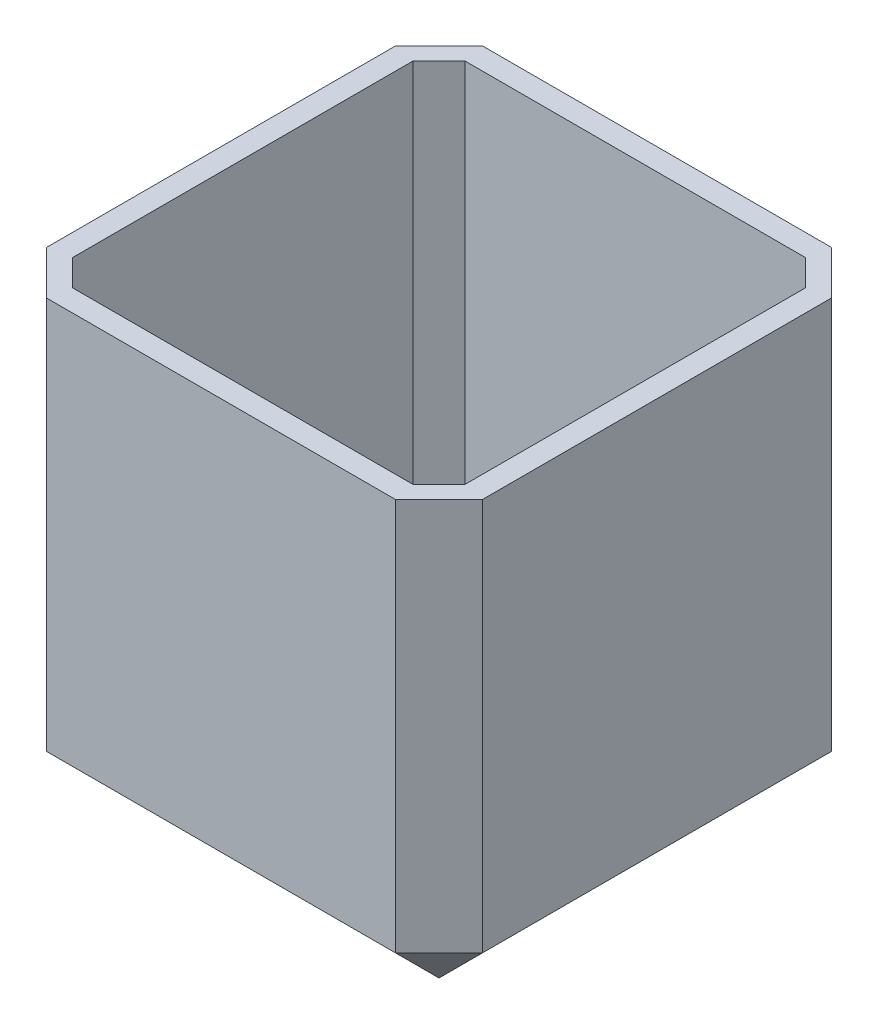
ISO-10303-21;
HEADER;
FILE_DESCRIPTION(('STEP AP214'),'2;1');
FILE_NAME('part.step','',(''),(''),'','','');
FILE_SCHEMA(('AUTOMOTIVE_DESIGN { 1 0 10303 214 1 1 1 1 }'));
ENDSEC;
DATA;
#1=APPLICATION_CONTEXT('core data for automotive mechanical design processes');
#2=APPLICATION_PROTOCOL_DEFINITION('international standard','automotive_design',2000,#1);
#3=PRODUCT_CONTEXT('',#1,'mechanical');
#4=PRODUCT('Part','Part','',(#3));
#5=PRODUCT_RELATED_PRODUCT_CATEGORY('part','',(#4));
#6=PRODUCT_DEFINITION_FORMATION('','',#4);
#7=PRODUCT_DEFINITION_CONTEXT('part definition',#1,'design');
#8=PRODUCT_DEFINITION('design','',#6,#7);
#9=PRODUCT_DEFINITION_SHAPE('','',#8);
#10=(LENGTH_UNIT() NAMED_UNIT(*) SI_UNIT(.MILLI.,.METRE.));
#11=(NAMED_UNIT(*) PLANE_ANGLE_UNIT() SI_UNIT($,.RADIAN.));
#12=(NAMED_UNIT(*) SI_UNIT($,.STERADIAN.) SOLID_ANGLE_UNIT());
#13=UNCERTAINTY_MEASURE_WITH_UNIT(LENGTH_MEASURE(1.E-05),#10,'distance_accuracy_value','');
#14=(GEOMETRIC_REPRESENTATION_CONTEXT(3) GLOBAL_UNCERTAINTY_ASSIGNED_CONTEXT((#13)) GLOBAL_UNIT_ASSIGNED_CONTEXT((#10,
#11,#12)) REPRESENTATION_CONTEXT('',''));
#15=CARTESIAN_POINT('',(0.,0.,0.));
#16=DIRECTION('',(0.,0.,1.));
#17=DIRECTION('',(1.,0.,0.));
#18=AXIS2_PLACEMENT_3D('',#15,#16,#17);
#19=CARTESIAN_POINT('',(0.,50.,0.));
#20=DIRECTION('',(0.,-1.,0.));
#21=DIRECTION('',(0.,0.,-1.));
#22=AXIS2_PLACEMENT_3D('',#19,#20,#21);
#23=PLANE('',#22);
#24=DIRECTION('',(0.707106781186548,0.,0.707106781186548));
#25=VECTOR('',#24,1.);
#26=CARTESIAN_POINT('',(20.,50.,-25.));
#27=LINE('',#26,#25);
#28=CARTESIAN_POINT('',(25.,50.,-20.));
#29=VERTEX_POINT('',#28);
#30=CARTESIAN_POINT('',(22.5,50.,-22.5));
#31=VERTEX_POINT('',#30);
#32=EDGE_CURVE('E222',#29,#31,#27,.F.);
#33=ORIENTED_EDGE('',*,*,#32,.T.);
#34=DIRECTION('',(0.707106781186548,0.,0.707106781186548));
#35=VECTOR('',#34,1.);
#36=CARTESIAN_POINT('',(20.,50.,-25.));
#37=LINE('',#36,#35);
#38=CARTESIAN_POINT('',(20.,50.,-25.));
#39=VERTEX_POINT('',#38);
#40=EDGE_CURVE('E206',#31,#39,#37,.F.);
#41=ORIENTED_EDGE('',*,*,#40,.T.);
#42=DIRECTION('',(-1.,0.,0.));
#43=VECTOR('',#42,1.);
#44=CARTESIAN_POINT('',(-25.,50.,-25.));
#45=LINE('',#44,#43);
#46=CARTESIAN_POINT('',(-20.,50.,-25.));
#47=VERTEX_POINT('',#46);
#48=EDGE_CURVE('E384',#39,#47,#45,.T.);
#49=ORIENTED_EDGE('',*,*,#48,.T.);
#50=DIRECTION('',(0.707106781186547,0.,-0.707106781186548));
#51=VECTOR('',#50,1.);
#52=CARTESIAN_POINT('',(-25.,50.,-20.));
#53=LINE('',#52,#51);
#54=CARTESIAN_POINT('',(-22.5,50.,-22.5));
#55=VERTEX_POINT('',#54);
#56=EDGE_CURVE('E228',#47,#55,#53,.F.);
#57=ORIENTED_EDGE('',*,*,#56,.T.);
#58=DIRECTION('',(0.707106781186547,0.,-0.707106781186548));
#59=VECTOR('',#58,1.);
#60=CARTESIAN_POINT('',(-25.,50.,-20.));
#61=LINE('',#60,#59);
#62=CARTESIAN_POINT('',(-25.,50.,-20.));
#63=VERTEX_POINT('',#62);
#64=EDGE_CURVE('E225',#55,#63,#61,.F.);
#65=ORIENTED_EDGE('',*,*,#64,.T.);
#66=DIRECTION('',(0.,0.,1.));
#67=VECTOR('',#66,1.);
#68=CARTESIAN_POINT('',(-25.,50.,25.));
#69=LINE('',#68,#67);
#70=CARTESIAN_POINT('',(-25.,50.,20.));
#71=VERTEX_POINT('',#70);
#72=EDGE_CURVE('E202',#63,#71,#69,.T.);
#73=ORIENTED_EDGE('',*,*,#72,.T.);
#74=DIRECTION('',(-0.707106781186548,0.,-0.707106781186548));
#75=VECTOR('',#74,1.);
#76=CARTESIAN_POINT('',(-20.,50.,25.));
#77=LINE('',#76,#75);
#78=CARTESIAN_POINT('',(-22.5,50.,22.5));
#79=VERTEX_POINT('',#78);
#80=EDGE_CURVE('E195',#71,#79,#77,.F.);
#81=ORIENTED_EDGE('',*,*,#80,.T.);
#82=DIRECTION('',(-0.707106781186548,0.,-0.707106781186548));
#83=VECTOR('',#82,1.);
#84=CARTESIAN_POINT('',(-20.,50.,25.));
#85=LINE('',#84,#83);
#86=CARTESIAN_POINT('',(-20.,50.,25.));
#87=VERTEX_POINT('',#86);
#88=EDGE_CURVE('E199',#79,#87,#85,.F.);
#89=ORIENTED_EDGE('',*,*,#88,.T.);
#90=DIRECTION('',(1.,0.,0.));
#91=VECTOR('',#90,1.);
#92=CARTESIAN_POINT('',(-25.,50.,25.));
#93=LINE('',#92,#91);
#94=CARTESIAN_POINT('',(20.,50.,25.));
#95=VERTEX_POINT('',#94);
#96=EDGE_CURVE('E390',#87,#95,#93,.T.);
#97=ORIENTED_EDGE('',*,*,#96,.T.);
#98=DIRECTION('',(-0.707106781186548,0.,0.707106781186547));
#99=VECTOR('',#98,1.);
#100=CARTESIAN_POINT('',(25.,50.,20.));
#101=LINE('',#100,#99);
#102=CARTESIAN_POINT('',(22.5,50.,22.5));
#103=VERTEX_POINT('',#102);
#104=EDGE_CURVE('E213',#95,#103,#101,.F.);
#105=ORIENTED_EDGE('',*,*,#104,.T.);
#106=DIRECTION('',(-0.707106781186548,0.,0.707106781186547));
#107=VECTOR('',#106,1.);
#108=CARTESIAN_POINT('',(25.,50.,20.));
#109=LINE('',#108,#107);
#110=CARTESIAN_POINT('',(25.,50.,20.));
#111=VERTEX_POINT('',#110);
#112=EDGE_CURVE('E216',#103,#111,#109,.F.);
#113=ORIENTED_EDGE('',*,*,#112,.T.);
#114=DIRECTION('',(0.,0.,-1.));
#115=VECTOR('',#114,1.);
#116=CARTESIAN_POINT('',(25.,50.,25.));
#117=LINE('',#116,#115);
#118=EDGE_CURVE('E375',#111,#29,#117,.T.);
#119=ORIENTED_EDGE('',*,*,#118,.T.);
#120=EDGE_LOOP('',(#33,#41,#49,#57,#65,#73,#81,#89,#97,#105,#113,#119));
#121=FACE_BOUND('',#120,.T.);
#122=DIRECTION('',(-0.707106781186548,0.,-0.707106781186548));
#123=VECTOR('',#122,1.);
#124=CARTESIAN_POINT('',(21.,50.,-21.));
#125=LINE('',#124,#123);
#126=CARTESIAN_POINT('',(19.5,50.,-22.5));
#127=VERTEX_POINT('',#126);
#128=CARTESIAN_POINT('',(22.5,50.,-19.5));
#129=VERTEX_POINT('',#128);
#130=EDGE_CURVE('E14',#127,#129,#125,.F.);
#131=ORIENTED_EDGE('',*,*,#130,.T.);
#132=DIRECTION('',(0.,0.,-1.));
#133=VECTOR('',#132,1.);
#134=CARTESIAN_POINT('',(22.5,50.,22.5));
#135=LINE('',#134,#133);
#136=CARTESIAN_POINT('',(22.5,50.,19.5));
#137=VERTEX_POINT('',#136);
#138=EDGE_CURVE('E72',#137,#129,#135,.T.);
#139=ORIENTED_EDGE('',*,*,#138,.F.);
#140=DIRECTION('',(0.707106781186549,0.,-0.707106781186546));
#141=VECTOR('',#140,1.);
#142=CARTESIAN_POINT('',(21.,50.,21.));
#143=LINE('',#142,#141);
#144=CARTESIAN_POINT('',(19.5,50.,22.5));
#145=VERTEX_POINT('',#144);
#146=EDGE_CURVE('E65',#137,#145,#143,.F.);
#147=ORIENTED_EDGE('',*,*,#146,.T.);
#148=DIRECTION('',(1.,0.,0.));
#149=VECTOR('',#148,1.);
#150=CARTESIAN_POINT('',(-22.5,50.,22.5));
#151=LINE('',#150,#149);
#152=CARTESIAN_POINT('',(-19.5,50.,22.5));
#153=VERTEX_POINT('',#152);
#154=EDGE_CURVE('E79',#153,#145,#151,.T.);
#155=ORIENTED_EDGE('',*,*,#154,.F.);
#156=DIRECTION('',(0.707106781186548,0.,0.707106781186548));
#157=VECTOR('',#156,1.);
#158=CARTESIAN_POINT('',(-21.,50.,21.));
#159=LINE('',#158,#157);
#160=CARTESIAN_POINT('',(-22.5,50.,19.5));
#161=VERTEX_POINT('',#160);
#162=EDGE_CURVE('E345',#153,#161,#159,.F.);
#163=ORIENTED_EDGE('',*,*,#162,.T.);
#164=DIRECTION('',(0.,0.,1.));
#165=VECTOR('',#164,1.);
#166=CARTESIAN_POINT('',(-22.5,50.,22.5));
#167=LINE('',#166,#165);
#168=CARTESIAN_POINT('',(-22.5,50.,-19.5));
#169=VERTEX_POINT('',#168);
#170=EDGE_CURVE('E519',#169,#161,#167,.T.);
#171=ORIENTED_EDGE('',*,*,#170,.F.);
#172=DIRECTION('',(-0.707106781186546,0.,0.707106781186549));
#173=VECTOR('',#172,1.);
#174=CARTESIAN_POINT('',(-21.,50.,-21.));
#175=LINE('',#174,#173);
#176=CARTESIAN_POINT('',(-19.5,50.,-22.5));
#177=VERTEX_POINT('',#176);
#178=EDGE_CURVE('E349',#169,#177,#175,.F.);
#179=ORIENTED_EDGE('',*,*,#178,.T.);
#180=DIRECTION('',(-1.,0.,0.));
#181=VECTOR('',#180,1.);
#182=CARTESIAN_POINT('',(-22.5,50.,-22.5));
#183=LINE('',#182,#181);
#184=EDGE_CURVE('E515',#127,#177,#183,.T.);
#185=ORIENTED_EDGE('',*,*,#184,.F.);
#186=EDGE_LOOP('',(#131,#139,#147,#155,#163,#171,#179,#185));
#187=FACE_BOUND('',#186,.T.);
#188=ADVANCED_FACE('F55',(#121,#187),#23,.F.);
#189=CARTESIAN_POINT('',(25.,50.,25.));
#190=DIRECTION('',(-1.,0.,0.));
#191=DIRECTION('',(0.,0.,1.));
#192=AXIS2_PLACEMENT_3D('',#189,#190,#191);
#193=PLANE('',#192);
#194=DIRECTION('',(0.,0.,-1.));
#195=VECTOR('',#194,1.);
#196=CARTESIAN_POINT('',(25.,5.,-25.));
#197=LINE('',#196,#195);
#198=CARTESIAN_POINT('',(25.,5.,20.));
#199=VERTEX_POINT('',#198);
#200=CARTESIAN_POINT('',(25.,5.,-20.));
#201=VERTEX_POINT('',#200);
#202=EDGE_CURVE('E247',#199,#201,#197,.T.);
#203=ORIENTED_EDGE('',*,*,#202,.T.);
#204=DIRECTION('',(0.,1.,0.));
#205=VECTOR('',#204,1.);
#206=CARTESIAN_POINT('',(25.,50.,-20.));
#207=LINE('',#206,#205);
#208=EDGE_CURVE('E250',#201,#29,#207,.T.);
#209=ORIENTED_EDGE('',*,*,#208,.T.);
#210=ORIENTED_EDGE('',*,*,#118,.F.);
#211=DIRECTION('',(0.,-1.,0.));
#212=VECTOR('',#211,1.);
#213=CARTESIAN_POINT('',(25.,50.,20.));
#214=LINE('',#213,#212);
#215=EDGE_CURVE('E244',#111,#199,#214,.T.);
#216=ORIENTED_EDGE('',*,*,#215,.T.);
#217=EDGE_LOOP('',(#203,#209,#210,#216));
#218=FACE_BOUND('',#217,.T.);
#219=ADVANCED_FACE('F419',(#218),#193,.F.);
#220=CARTESIAN_POINT('',(-25.,50.,-25.));
#221=DIRECTION('',(0.,0.,1.));
#222=DIRECTION('',(1.,0.,0.));
#223=AXIS2_PLACEMENT_3D('',#220,#221,#222);
#224=PLANE('',#223);
#225=DIRECTION('',(-1.,0.,0.));
#226=VECTOR('',#225,1.);
#227=CARTESIAN_POINT('',(-25.,5.,-25.));
#228=LINE('',#227,#226);
#229=CARTESIAN_POINT('',(20.,5.,-25.));
#230=VERTEX_POINT('',#229);
#231=CARTESIAN_POINT('',(-20.,5.,-25.));
#232=VERTEX_POINT('',#231);
#233=EDGE_CURVE('E406',#230,#232,#228,.T.);
#234=ORIENTED_EDGE('',*,*,#233,.T.);
#235=DIRECTION('',(0.,1.,0.));
#236=VECTOR('',#235,1.);
#237=CARTESIAN_POINT('',(-20.,50.,-25.));
#238=LINE('',#237,#236);
#239=EDGE_CURVE('E409',#232,#47,#238,.T.);
#240=ORIENTED_EDGE('',*,*,#239,.T.);
#241=ORIENTED_EDGE('',*,*,#48,.F.);
#242=DIRECTION('',(0.,-1.,0.));
#243=VECTOR('',#242,1.);
#244=CARTESIAN_POINT('',(20.,50.,-25.));
#245=LINE('',#244,#243);
#246=EDGE_CURVE('E403',#39,#230,#245,.T.);
#247=ORIENTED_EDGE('',*,*,#246,.T.);
#248=EDGE_LOOP('',(#234,#240,#241,#247));
#249=FACE_BOUND('',#248,.T.);
#250=ADVANCED_FACE('F443',(#249),#224,.F.);
#251=CARTESIAN_POINT('',(-25.,50.,25.));
#252=DIRECTION('',(1.,0.,0.));
#253=DIRECTION('',(0.,0.,-1.));
#254=AXIS2_PLACEMENT_3D('',#251,#252,#253);
#255=PLANE('',#254);
#256=ORIENTED_EDGE('',*,*,#72,.F.);
#257=DIRECTION('',(0.,-1.,0.));
#258=VECTOR('',#257,1.);
#259=CARTESIAN_POINT('',(-25.,50.,-20.));
#260=LINE('',#259,#258);
#261=CARTESIAN_POINT('',(-25.,5.,-20.));
#262=VERTEX_POINT('',#261);
#263=EDGE_CURVE('E399',#63,#262,#260,.T.);
#264=ORIENTED_EDGE('',*,*,#263,.T.);
#265=DIRECTION('',(0.,0.,1.));
#266=VECTOR('',#265,1.);
#267=CARTESIAN_POINT('',(-25.,5.,25.));
#268=LINE('',#267,#266);
#269=CARTESIAN_POINT('',(-25.,5.,20.));
#270=VERTEX_POINT('',#269);
#271=EDGE_CURVE('E396',#262,#270,#268,.T.);
#272=ORIENTED_EDGE('',*,*,#271,.T.);
#273=DIRECTION('',(0.,1.,0.));
#274=VECTOR('',#273,1.);
#275=CARTESIAN_POINT('',(-25.,50.,20.));
#276=LINE('',#275,#274);
#277=EDGE_CURVE('E393',#270,#71,#276,.T.);
#278=ORIENTED_EDGE('',*,*,#277,.T.);
#279=EDGE_LOOP('',(#256,#264,#272,#278));
#280=FACE_BOUND('',#279,.T.);
#281=ADVANCED_FACE('F462',(#280),#255,.F.);
#282=CARTESIAN_POINT('',(-25.,50.,25.));
#283=DIRECTION('',(0.,0.,-1.));
#284=DIRECTION('',(-1.,0.,0.));
#285=AXIS2_PLACEMENT_3D('',#282,#283,#284);
#286=PLANE('',#285);
#287=ORIENTED_EDGE('',*,*,#96,.F.);
#288=DIRECTION('',(0.,-1.,0.));
#289=VECTOR('',#288,1.);
#290=CARTESIAN_POINT('',(-20.,50.,25.));
#291=LINE('',#290,#289);
#292=CARTESIAN_POINT('',(-20.,5.,25.));
#293=VERTEX_POINT('',#292);
#294=EDGE_CURVE('E211',#87,#293,#291,.T.);
#295=ORIENTED_EDGE('',*,*,#294,.T.);
#296=DIRECTION('',(1.,0.,0.));
#297=VECTOR('',#296,1.);
#298=CARTESIAN_POINT('',(25.,5.,25.));
#299=LINE('',#298,#297);
#300=CARTESIAN_POINT('',(20.,5.,25.));
#301=VERTEX_POINT('',#300);
#302=EDGE_CURVE('E256',#293,#301,#299,.T.);
#303=ORIENTED_EDGE('',*,*,#302,.T.);
#304=DIRECTION('',(0.,1.,0.));
#305=VECTOR('',#304,1.);
#306=CARTESIAN_POINT('',(20.,50.,25.));
#307=LINE('',#306,#305);
#308=EDGE_CURVE('E253',#301,#95,#307,.T.);
#309=ORIENTED_EDGE('',*,*,#308,.T.);
#310=EDGE_LOOP('',(#287,#295,#303,#309));
#311=FACE_BOUND('',#310,.T.);
#312=ADVANCED_FACE('F470',(#311),#286,.F.);
#313=CARTESIAN_POINT('',(0.,0.,0.));
#314=DIRECTION('',(0.,-1.,0.));
#315=DIRECTION('',(0.,0.,-1.));
#316=AXIS2_PLACEMENT_3D('',#313,#314,#315);
#317=PLANE('',#316);
#318=DIRECTION('',(-1.,0.,0.));
#319=VECTOR('',#318,1.);
#320=CARTESIAN_POINT('',(-25.,0.,20.));
#321=LINE('',#320,#319);
#322=CARTESIAN_POINT('',(20.,0.,20.));
#323=VERTEX_POINT('',#322);
#324=CARTESIAN_POINT('',(-20.,0.,20.));
#325=VERTEX_POINT('',#324);
#326=EDGE_CURVE('E231',#323,#325,#321,.T.);
#327=ORIENTED_EDGE('',*,*,#326,.T.);
#328=DIRECTION('',(0.,0.,-1.));
#329=VECTOR('',#328,1.);
#330=CARTESIAN_POINT('',(-20.,0.,-25.));
#331=LINE('',#330,#329);
#332=CARTESIAN_POINT('',(-20.,0.,-20.));
#333=VERTEX_POINT('',#332);
#334=EDGE_CURVE('E240',#325,#333,#331,.T.);
#335=ORIENTED_EDGE('',*,*,#334,.T.);
#336=DIRECTION('',(1.,0.,0.));
#337=VECTOR('',#336,1.);
#338=CARTESIAN_POINT('',(25.,0.,-20.));
#339=LINE('',#338,#337);
#340=CARTESIAN_POINT('',(20.,0.,-20.));
#341=VERTEX_POINT('',#340);
#342=EDGE_CURVE('E237',#333,#341,#339,.T.);
#343=ORIENTED_EDGE('',*,*,#342,.T.);
#344=DIRECTION('',(0.,0.,1.));
#345=VECTOR('',#344,1.);
#346=CARTESIAN_POINT('',(20.,0.,25.));
#347=LINE('',#346,#345);
#348=EDGE_CURVE('E234',#341,#323,#347,.T.);
#349=ORIENTED_EDGE('',*,*,#348,.T.);
#350=EDGE_LOOP('',(#327,#335,#343,#349));
#351=FACE_BOUND('',#350,.T.);
#352=ADVANCED_FACE('F472',(#351),#317,.T.);
#353=CARTESIAN_POINT('',(0.,5.,0.));
#354=DIRECTION('',(0.,-1.,0.));
#355=DIRECTION('',(0.,0.,-1.));
#356=AXIS2_PLACEMENT_3D('',#353,#354,#355);
#357=PLANE('',#356);
#358=DIRECTION('',(0.,0.,1.));
#359=VECTOR('',#358,1.);
#360=CARTESIAN_POINT('',(-22.5,5.,22.5));
#361=LINE('',#360,#359);
#362=CARTESIAN_POINT('',(-22.5,5.,-19.5));
#363=VERTEX_POINT('',#362);
#364=CARTESIAN_POINT('',(-22.5,5.,19.5));
#365=VERTEX_POINT('',#364);
#366=EDGE_CURVE('E371',#363,#365,#361,.T.);
#367=ORIENTED_EDGE('',*,*,#366,.T.);
#368=DIRECTION('',(-0.707106781186548,0.,-0.707106781186548));
#369=VECTOR('',#368,1.);
#370=CARTESIAN_POINT('',(-19.5,5.,22.5));
#371=LINE('',#370,#369);
#372=CARTESIAN_POINT('',(-19.5,5.,22.5));
#373=VERTEX_POINT('',#372);
#374=EDGE_CURVE('E329',#365,#373,#371,.F.);
#375=ORIENTED_EDGE('',*,*,#374,.T.);
#376=DIRECTION('',(1.,0.,0.));
#377=VECTOR('',#376,1.);
#378=CARTESIAN_POINT('',(-22.5,5.,22.5));
#379=LINE('',#378,#377);
#380=CARTESIAN_POINT('',(19.5,5.,22.5));
#381=VERTEX_POINT('',#380);
#382=EDGE_CURVE('E361',#373,#381,#379,.T.);
#383=ORIENTED_EDGE('',*,*,#382,.T.);
#384=DIRECTION('',(-0.707106781186549,0.,0.707106781186546));
#385=VECTOR('',#384,1.);
#386=CARTESIAN_POINT('',(22.5,5.,19.5));
#387=LINE('',#386,#385);
#388=CARTESIAN_POINT('',(22.5,5.,19.5));
#389=VERTEX_POINT('',#388);
#390=EDGE_CURVE('E323',#381,#389,#387,.F.);
#391=ORIENTED_EDGE('',*,*,#390,.T.);
#392=DIRECTION('',(0.,0.,-1.));
#393=VECTOR('',#392,1.);
#394=CARTESIAN_POINT('',(22.5,5.,22.5));
#395=LINE('',#394,#393);
#396=CARTESIAN_POINT('',(22.5,5.,-19.5));
#397=VERTEX_POINT('',#396);
#398=EDGE_CURVE('E370',#389,#397,#395,.T.);
#399=ORIENTED_EDGE('',*,*,#398,.T.);
#400=DIRECTION('',(0.707106781186548,0.,0.707106781186548));
#401=VECTOR('',#400,1.);
#402=CARTESIAN_POINT('',(19.5,5.,-22.5));
#403=LINE('',#402,#401);
#404=CARTESIAN_POINT('',(19.5,5.,-22.5));
#405=VERTEX_POINT('',#404);
#406=EDGE_CURVE('E320',#397,#405,#403,.F.);
#407=ORIENTED_EDGE('',*,*,#406,.T.);
#408=DIRECTION('',(-1.,0.,0.));
#409=VECTOR('',#408,1.);
#410=CARTESIAN_POINT('',(-22.5,5.,-22.5));
#411=LINE('',#410,#409);
#412=CARTESIAN_POINT('',(-19.5,5.,-22.5));
#413=VERTEX_POINT('',#412);
#414=EDGE_CURVE('E377',#405,#413,#411,.T.);
#415=ORIENTED_EDGE('',*,*,#414,.T.);
#416=DIRECTION('',(0.707106781186546,0.,-0.707106781186549));
#417=VECTOR('',#416,1.);
#418=CARTESIAN_POINT('',(-22.5,5.,-19.5));
#419=LINE('',#418,#417);
#420=EDGE_CURVE('E326',#413,#363,#419,.F.);
#421=ORIENTED_EDGE('',*,*,#420,.T.);
#422=EDGE_LOOP('',(#367,#375,#383,#391,#399,#407,#415,#421));
#423=FACE_BOUND('',#422,.T.);
#424=ADVANCED_FACE('F365',(#423),#357,.F.);
#425=CARTESIAN_POINT('',(-22.5,-63.6396103067893,-22.5));
#426=DIRECTION('',(0.,0.,-1.));
#427=DIRECTION('',(-1.,0.,0.));
#428=AXIS2_PLACEMENT_3D('',#425,#426,#427);
#429=PLANE('',#428);
#430=ORIENTED_EDGE('',*,*,#184,.T.);
#431=DIRECTION('',(0.,-1.,0.));
#432=VECTOR('',#431,1.);
#433=CARTESIAN_POINT('',(-19.5,5.,-22.5));
#434=LINE('',#433,#432);
#435=EDGE_CURVE('E336',#177,#413,#434,.T.);
#436=ORIENTED_EDGE('',*,*,#435,.T.);
#437=ORIENTED_EDGE('',*,*,#414,.F.);
#438=DIRECTION('',(0.,1.,0.));
#439=VECTOR('',#438,1.);
#440=CARTESIAN_POINT('',(19.5,50.,-22.5));
#441=LINE('',#440,#439);
#442=EDGE_CURVE('E332',#405,#127,#441,.T.);
#443=ORIENTED_EDGE('',*,*,#442,.T.);
#444=EDGE_LOOP('',(#430,#436,#437,#443));
#445=FACE_BOUND('',#444,.T.);
#446=ADVANCED_FACE('F491',(#445),#429,.F.);
#447=CARTESIAN_POINT('',(-22.5,-63.6396103067893,22.5));
#448=DIRECTION('',(-1.,0.,0.));
#449=DIRECTION('',(0.,0.,1.));
#450=AXIS2_PLACEMENT_3D('',#447,#448,#449);
#451=PLANE('',#450);
#452=ORIENTED_EDGE('',*,*,#170,.T.);
#453=DIRECTION('',(0.,-1.,0.));
#454=VECTOR('',#453,1.);
#455=CARTESIAN_POINT('',(-22.5,5.,19.5));
#456=LINE('',#455,#454);
#457=EDGE_CURVE('E317',#161,#365,#456,.T.);
#458=ORIENTED_EDGE('',*,*,#457,.T.);
#459=ORIENTED_EDGE('',*,*,#366,.F.);
#460=DIRECTION('',(0.,1.,0.));
#461=VECTOR('',#460,1.);
#462=CARTESIAN_POINT('',(-22.5,50.,-19.5));
#463=LINE('',#462,#461);
#464=EDGE_CURVE('E313',#363,#169,#463,.T.);
#465=ORIENTED_EDGE('',*,*,#464,.T.);
#466=EDGE_LOOP('',(#452,#458,#459,#465));
#467=FACE_BOUND('',#466,.T.);
#468=ADVANCED_FACE('F494',(#467),#451,.F.);
#469=CARTESIAN_POINT('',(-22.5,-63.6396103067893,22.5));
#470=DIRECTION('',(0.,0.,1.));
#471=DIRECTION('',(1.,0.,0.));
#472=AXIS2_PLACEMENT_3D('',#469,#470,#471);
#473=PLANE('',#472);
#474=ORIENTED_EDGE('',*,*,#382,.F.);
#475=DIRECTION('',(0.,1.,0.));
#476=VECTOR('',#475,1.);
#477=CARTESIAN_POINT('',(-19.5,50.,22.5));
#478=LINE('',#477,#476);
#479=EDGE_CURVE('E310',#373,#153,#478,.T.);
#480=ORIENTED_EDGE('',*,*,#479,.T.);
#481=ORIENTED_EDGE('',*,*,#154,.T.);
#482=DIRECTION('',(0.,-1.,0.));
#483=VECTOR('',#482,1.);
#484=CARTESIAN_POINT('',(19.5,5.,22.5));
#485=LINE('',#484,#483);
#486=EDGE_CURVE('E261',#145,#381,#485,.T.);
#487=ORIENTED_EDGE('',*,*,#486,.T.);
#488=EDGE_LOOP('',(#474,#480,#481,#487));
#489=FACE_BOUND('',#488,.T.);
#490=ADVANCED_FACE('F360',(#489),#473,.F.);
#491=CARTESIAN_POINT('',(22.5,-63.6396103067893,22.5));
#492=DIRECTION('',(1.,0.,0.));
#493=DIRECTION('',(0.,0.,-1.));
#494=AXIS2_PLACEMENT_3D('',#491,#492,#493);
#495=PLANE('',#494);
#496=ORIENTED_EDGE('',*,*,#398,.F.);
#497=DIRECTION('',(0.,1.,0.));
#498=VECTOR('',#497,1.);
#499=CARTESIAN_POINT('',(22.5,50.,19.5));
#500=LINE('',#499,#498);
#501=EDGE_CURVE('E342',#389,#137,#500,.T.);
#502=ORIENTED_EDGE('',*,*,#501,.T.);
#503=ORIENTED_EDGE('',*,*,#138,.T.);
#504=DIRECTION('',(0.,-1.,0.));
#505=VECTOR('',#504,1.);
#506=CARTESIAN_POINT('',(22.5,5.,-19.5));
#507=LINE('',#506,#505);
#508=EDGE_CURVE('E339',#129,#397,#507,.T.);
#509=ORIENTED_EDGE('',*,*,#508,.T.);
#510=EDGE_LOOP('',(#496,#502,#503,#509));
#511=FACE_BOUND('',#510,.T.);
#512=ADVANCED_FACE('F501',(#511),#495,.F.);
#513=CARTESIAN_POINT('',(25.,50.,20.));
#514=DIRECTION('',(-0.707106781186547,0.,-0.707106781186548));
#515=DIRECTION('',(0.,-1.,0.));
#516=AXIS2_PLACEMENT_3D('',#513,#514,#515);
#517=PLANE('',#516);
#518=DIRECTION('',(0.707106781186548,0.,-0.707106781186547));
#519=VECTOR('',#518,1.);
#520=CARTESIAN_POINT('',(22.5,5.,22.5));
#521=LINE('',#520,#519);
#522=EDGE_CURVE('E304',#199,#301,#521,.F.);
#523=ORIENTED_EDGE('',*,*,#522,.F.);
#524=ORIENTED_EDGE('',*,*,#215,.F.);
#525=ORIENTED_EDGE('',*,*,#112,.F.);
#526=ORIENTED_EDGE('',*,*,#104,.F.);
#527=ORIENTED_EDGE('',*,*,#308,.F.);
#528=EDGE_LOOP('',(#523,#524,#525,#526,#527));
#529=FACE_BOUND('',#528,.T.);
#530=ADVANCED_FACE('F422',(#529),#517,.F.);
#531=CARTESIAN_POINT('',(20.,0.,20.));
#532=DIRECTION('',(0.577350269189626,-0.577350269189626,0.577350269189626));
#533=DIRECTION('',(0.,-0.707106781186547,-0.707106781186548));
#534=AXIS2_PLACEMENT_3D('',#531,#532,#533);
#535=PLANE('',#534);
#536=DIRECTION('',(0.707106781186548,0.707106781186547,0.));
#537=VECTOR('',#536,1.);
#538=CARTESIAN_POINT('',(20.,0.,20.));
#539=LINE('',#538,#537);
#540=EDGE_CURVE('E296',#199,#323,#539,.F.);
#541=ORIENTED_EDGE('',*,*,#540,.F.);
#542=ORIENTED_EDGE('',*,*,#522,.T.);
#543=DIRECTION('',(0.,-0.707106781186547,-0.707106781186548));
#544=VECTOR('',#543,1.);
#545=CARTESIAN_POINT('',(20.,0.,20.));
#546=LINE('',#545,#544);
#547=EDGE_CURVE('E300',#323,#301,#546,.F.);
#548=ORIENTED_EDGE('',*,*,#547,.F.);
#549=EDGE_LOOP('',(#541,#542,#548));
#550=FACE_BOUND('',#549,.T.);
#551=ADVANCED_FACE('F428',(#550),#535,.T.);
#552=CARTESIAN_POINT('',(-20.,50.,25.));
#553=DIRECTION('',(0.707106781186548,0.,-0.707106781186548));
#554=DIRECTION('',(0.,-1.,0.));
#555=AXIS2_PLACEMENT_3D('',#552,#553,#554);
#556=PLANE('',#555);
#557=ORIENTED_EDGE('',*,*,#80,.F.);
#558=ORIENTED_EDGE('',*,*,#277,.F.);
#559=DIRECTION('',(0.707106781186548,0.,0.707106781186548));
#560=VECTOR('',#559,1.);
#561=CARTESIAN_POINT('',(-25.,5.,20.));
#562=LINE('',#561,#560);
#563=EDGE_CURVE('E292',#293,#270,#562,.F.);
#564=ORIENTED_EDGE('',*,*,#563,.F.);
#565=ORIENTED_EDGE('',*,*,#294,.F.);
#566=ORIENTED_EDGE('',*,*,#88,.F.);
#567=EDGE_LOOP('',(#557,#558,#564,#565,#566));
#568=FACE_BOUND('',#567,.T.);
#569=ADVANCED_FACE('F209',(#568),#556,.F.);
#570=CARTESIAN_POINT('',(-25.,5.,25.));
#571=DIRECTION('',(0.,-0.707106781186548,0.707106781186547));
#572=DIRECTION('',(-1.,0.,0.));
#573=AXIS2_PLACEMENT_3D('',#570,#571,#572);
#574=PLANE('',#573);
#575=ORIENTED_EDGE('',*,*,#547,.T.);
#576=ORIENTED_EDGE('',*,*,#302,.F.);
#577=DIRECTION('',(0.,0.707106781186547,0.707106781186548));
#578=VECTOR('',#577,1.);
#579=CARTESIAN_POINT('',(-20.,2.5,22.5));
#580=LINE('',#579,#578);
#581=EDGE_CURVE('E288',#325,#293,#580,.T.);
#582=ORIENTED_EDGE('',*,*,#581,.F.);
#583=ORIENTED_EDGE('',*,*,#326,.F.);
#584=EDGE_LOOP('',(#575,#576,#582,#583));
#585=FACE_BOUND('',#584,.T.);
#586=ADVANCED_FACE('F468',(#585),#574,.T.);
#587=CARTESIAN_POINT('',(25.,5.,25.));
#588=DIRECTION('',(0.707106781186547,-0.707106781186548,0.));
#589=DIRECTION('',(0.,0.,1.));
#590=AXIS2_PLACEMENT_3D('',#587,#588,#589);
#591=PLANE('',#590);
#592=ORIENTED_EDGE('',*,*,#540,.T.);
#593=ORIENTED_EDGE('',*,*,#348,.F.);
#594=DIRECTION('',(-0.707106781186548,-0.707106781186547,0.));
#595=VECTOR('',#594,1.);
#596=CARTESIAN_POINT('',(20.,0.,-20.));
#597=LINE('',#596,#595);
#598=EDGE_CURVE('E284',#201,#341,#597,.T.);
#599=ORIENTED_EDGE('',*,*,#598,.F.);
#600=ORIENTED_EDGE('',*,*,#202,.F.);
#601=EDGE_LOOP('',(#592,#593,#599,#600));
#602=FACE_BOUND('',#601,.T.);
#603=ADVANCED_FACE('F433',(#602),#591,.T.);
#604=CARTESIAN_POINT('',(20.,50.,-25.));
#605=DIRECTION('',(-0.707106781186547,0.,0.707106781186547));
#606=DIRECTION('',(0.,-1.,0.));
#607=AXIS2_PLACEMENT_3D('',#604,#605,#606);
#608=PLANE('',#607);
#609=ORIENTED_EDGE('',*,*,#32,.F.);
#610=ORIENTED_EDGE('',*,*,#208,.F.);
#611=DIRECTION('',(-0.707106781186548,0.,-0.707106781186548));
#612=VECTOR('',#611,1.);
#613=CARTESIAN_POINT('',(22.5,5.,-22.5));
#614=LINE('',#613,#612);
#615=EDGE_CURVE('E280',#230,#201,#614,.F.);
#616=ORIENTED_EDGE('',*,*,#615,.F.);
#617=ORIENTED_EDGE('',*,*,#246,.F.);
#618=ORIENTED_EDGE('',*,*,#40,.F.);
#619=EDGE_LOOP('',(#609,#610,#616,#617,#618));
#620=FACE_BOUND('',#619,.T.);
#621=ADVANCED_FACE('F436',(#620),#608,.F.);
#622=CARTESIAN_POINT('',(-25.,5.,20.));
#623=DIRECTION('',(-0.577350269189626,-0.577350269189626,0.577350269189626));
#624=DIRECTION('',(0.,-0.707106781186547,-0.707106781186548));
#625=AXIS2_PLACEMENT_3D('',#622,#623,#624);
#626=PLANE('',#625);
#627=ORIENTED_EDGE('',*,*,#581,.T.);
#628=ORIENTED_EDGE('',*,*,#563,.T.);
#629=DIRECTION('',(0.707106781186548,-0.707106781186547,0.));
#630=VECTOR('',#629,1.);
#631=CARTESIAN_POINT('',(-25.,5.,20.));
#632=LINE('',#631,#630);
#633=EDGE_CURVE('E276',#325,#270,#632,.F.);
#634=ORIENTED_EDGE('',*,*,#633,.F.);
#635=EDGE_LOOP('',(#627,#628,#634));
#636=FACE_BOUND('',#635,.T.);
#637=ADVANCED_FACE('F464',(#636),#626,.T.);
#638=CARTESIAN_POINT('',(20.,0.,-20.));
#639=DIRECTION('',(0.577350269189626,-0.577350269189626,-0.577350269189626));
#640=DIRECTION('',(0.,0.707106781186547,-0.707106781186548));
#641=AXIS2_PLACEMENT_3D('',#638,#639,#640);
#642=PLANE('',#641);
#643=ORIENTED_EDGE('',*,*,#615,.T.);
#644=ORIENTED_EDGE('',*,*,#598,.T.);
#645=DIRECTION('',(0.,0.707106781186547,-0.707106781186548));
#646=VECTOR('',#645,1.);
#647=CARTESIAN_POINT('',(20.,0.,-20.));
#648=LINE('',#647,#646);
#649=EDGE_CURVE('E272',#230,#341,#648,.F.);
#650=ORIENTED_EDGE('',*,*,#649,.F.);
#651=EDGE_LOOP('',(#643,#644,#650));
#652=FACE_BOUND('',#651,.T.);
#653=ADVANCED_FACE('F608',(#652),#642,.T.);
#654=CARTESIAN_POINT('',(-25.,5.,25.));
#655=DIRECTION('',(-0.707106781186547,-0.707106781186548,0.));
#656=DIRECTION('',(0.,0.,-1.));
#657=AXIS2_PLACEMENT_3D('',#654,#655,#656);
#658=PLANE('',#657);
#659=ORIENTED_EDGE('',*,*,#633,.T.);
#660=ORIENTED_EDGE('',*,*,#271,.F.);
#661=DIRECTION('',(-0.707106781186548,0.707106781186547,0.));
#662=VECTOR('',#661,1.);
#663=CARTESIAN_POINT('',(-25.,5.,-20.));
#664=LINE('',#663,#662);
#665=EDGE_CURVE('E268',#333,#262,#664,.T.);
#666=ORIENTED_EDGE('',*,*,#665,.F.);
#667=ORIENTED_EDGE('',*,*,#334,.F.);
#668=EDGE_LOOP('',(#659,#660,#666,#667));
#669=FACE_BOUND('',#668,.T.);
#670=ADVANCED_FACE('F459',(#669),#658,.T.);
#671=CARTESIAN_POINT('',(-25.,5.,-25.));
#672=DIRECTION('',(0.,-0.707106781186548,-0.707106781186547));
#673=DIRECTION('',(1.,0.,0.));
#674=AXIS2_PLACEMENT_3D('',#671,#672,#673);
#675=PLANE('',#674);
#676=ORIENTED_EDGE('',*,*,#649,.T.);
#677=ORIENTED_EDGE('',*,*,#342,.F.);
#678=DIRECTION('',(0.,-0.707106781186547,0.707106781186548));
#679=VECTOR('',#678,1.);
#680=CARTESIAN_POINT('',(-20.,2.5,-22.5));
#681=LINE('',#680,#679);
#682=EDGE_CURVE('E265',#232,#333,#681,.T.);
#683=ORIENTED_EDGE('',*,*,#682,.F.);
#684=ORIENTED_EDGE('',*,*,#233,.F.);
#685=EDGE_LOOP('',(#676,#677,#683,#684));
#686=FACE_BOUND('',#685,.T.);
#687=ADVANCED_FACE('F590',(#686),#675,.T.);
#688=CARTESIAN_POINT('',(-25.,5.,-20.));
#689=DIRECTION('',(-0.577350269189626,-0.577350269189626,-0.577350269189626));
#690=DIRECTION('',(0.707106781186548,-0.707106781186548,0.));
#691=AXIS2_PLACEMENT_3D('',#688,#689,#690);
#692=PLANE('',#691);
#693=ORIENTED_EDGE('',*,*,#682,.T.);
#694=ORIENTED_EDGE('',*,*,#665,.T.);
#695=DIRECTION('',(-0.707106781186547,0.,0.707106781186548));
#696=VECTOR('',#695,1.);
#697=CARTESIAN_POINT('',(-25.,5.,-20.));
#698=LINE('',#697,#696);
#699=EDGE_CURVE('E262',#232,#262,#698,.T.);
#700=ORIENTED_EDGE('',*,*,#699,.F.);
#701=EDGE_LOOP('',(#693,#694,#700));
#702=FACE_BOUND('',#701,.T.);
#703=ADVANCED_FACE('F453',(#702),#692,.T.);
#704=CARTESIAN_POINT('',(-25.,50.,-20.));
#705=DIRECTION('',(0.707106781186548,0.,0.707106781186547));
#706=DIRECTION('',(0.,-1.,0.));
#707=AXIS2_PLACEMENT_3D('',#704,#705,#706);
#708=PLANE('',#707);
#709=ORIENTED_EDGE('',*,*,#56,.F.);
#710=ORIENTED_EDGE('',*,*,#239,.F.);
#711=ORIENTED_EDGE('',*,*,#699,.T.);
#712=ORIENTED_EDGE('',*,*,#263,.F.);
#713=ORIENTED_EDGE('',*,*,#64,.F.);
#714=EDGE_LOOP('',(#709,#710,#711,#712,#713));
#715=FACE_BOUND('',#714,.T.);
#716=ADVANCED_FACE('F449',(#715),#708,.F.);
#717=CARTESIAN_POINT('',(-19.5,-63.6396103067893,22.5));
#718=DIRECTION('',(0.707106781186548,0.,-0.707106781186548));
#719=DIRECTION('',(0.,-1.,0.));
#720=AXIS2_PLACEMENT_3D('',#717,#718,#719);
#721=PLANE('',#720);
#722=ORIENTED_EDGE('',*,*,#374,.F.);
#723=ORIENTED_EDGE('',*,*,#457,.F.);
#724=ORIENTED_EDGE('',*,*,#162,.F.);
#725=ORIENTED_EDGE('',*,*,#479,.F.);
#726=EDGE_LOOP('',(#722,#723,#724,#725));
#727=FACE_BOUND('',#726,.T.);
#728=ADVANCED_FACE('F535',(#727),#721,.T.);
#729=CARTESIAN_POINT('',(-22.5,-63.6396103067893,-19.5));
#730=DIRECTION('',(0.707106781186549,0.,0.707106781186546));
#731=DIRECTION('',(0.,-1.,0.));
#732=AXIS2_PLACEMENT_3D('',#729,#730,#731);
#733=PLANE('',#732);
#734=ORIENTED_EDGE('',*,*,#420,.F.);
#735=ORIENTED_EDGE('',*,*,#435,.F.);
#736=ORIENTED_EDGE('',*,*,#178,.F.);
#737=ORIENTED_EDGE('',*,*,#464,.F.);
#738=EDGE_LOOP('',(#734,#735,#736,#737));
#739=FACE_BOUND('',#738,.T.);
#740=ADVANCED_FACE('F532',(#739),#733,.T.);
#741=CARTESIAN_POINT('',(22.5,-63.6396103067893,19.5));
#742=DIRECTION('',(-0.707106781186546,0.,-0.707106781186549));
#743=DIRECTION('',(0.,-1.,0.));
#744=AXIS2_PLACEMENT_3D('',#741,#742,#743);
#745=PLANE('',#744);
#746=ORIENTED_EDGE('',*,*,#390,.F.);
#747=ORIENTED_EDGE('',*,*,#486,.F.);
#748=ORIENTED_EDGE('',*,*,#146,.F.);
#749=ORIENTED_EDGE('',*,*,#501,.F.);
#750=EDGE_LOOP('',(#746,#747,#748,#749));
#751=FACE_BOUND('',#750,.T.);
#752=ADVANCED_FACE('F357',(#751),#745,.T.);
#753=CARTESIAN_POINT('',(19.5,-63.6396103067893,-22.5));
#754=DIRECTION('',(-0.707106781186547,0.,0.707106781186547));
#755=DIRECTION('',(0.,-1.,0.));
#756=AXIS2_PLACEMENT_3D('',#753,#754,#755);
#757=PLANE('',#756);
#758=ORIENTED_EDGE('',*,*,#406,.F.);
#759=ORIENTED_EDGE('',*,*,#508,.F.);
#760=ORIENTED_EDGE('',*,*,#130,.F.);
#761=ORIENTED_EDGE('',*,*,#442,.F.);
#762=EDGE_LOOP('',(#758,#759,#760,#761));
#763=FACE_BOUND('',#762,.T.);
#764=ADVANCED_FACE('F58',(#763),#757,.T.);
#765=CLOSED_SHELL('',(#188,#219,#250,#281,#312,#352,#424,#446,#468,#490,#512,#530,#551,#569,
#586,#603,#621,#637,#653,#670,#687,#703,#716,#728,#740,#752,#764));
#766=MANIFOLD_SOLID_BREP('B2',#765);
#767=ADVANCED_BREP_SHAPE_REPRESENTATION('',(#18,#766),#14);
#768=SHAPE_DEFINITION_REPRESENTATION(#9,#767);
ENDSEC;
END-ISO-10303-21;
